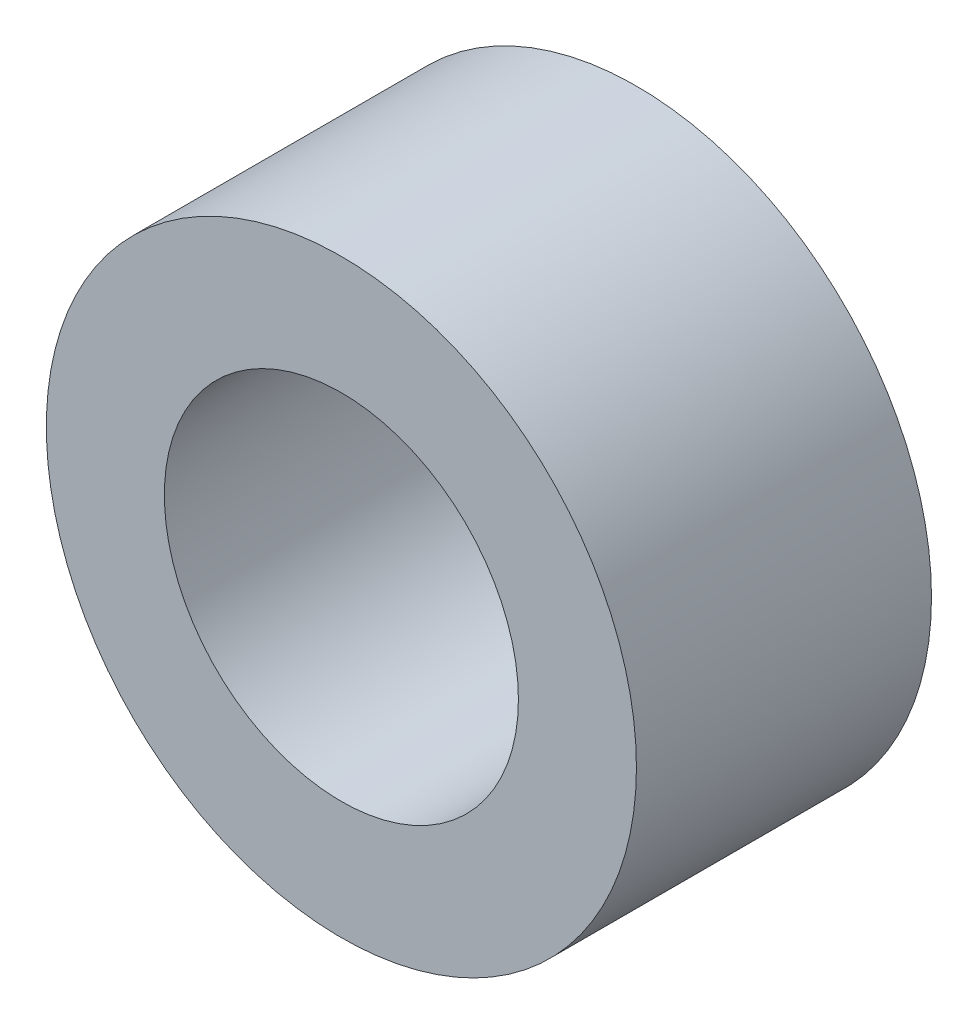
ISO-10303-21;
HEADER;
FILE_DESCRIPTION(('STEP AP214'),'2;1');
FILE_NAME('part.step','',(''),(''),'','','');
FILE_SCHEMA(('AUTOMOTIVE_DESIGN { 1 0 10303 214 1 1 1 1 }'));
ENDSEC;
DATA;
#1=APPLICATION_CONTEXT('core data for automotive mechanical design processes');
#2=APPLICATION_PROTOCOL_DEFINITION('international standard','automotive_design',2000,#1);
#3=PRODUCT_CONTEXT('',#1,'mechanical');
#4=PRODUCT('Part','Part','',(#3));
#5=PRODUCT_RELATED_PRODUCT_CATEGORY('part','',(#4));
#6=PRODUCT_DEFINITION_FORMATION('','',#4);
#7=PRODUCT_DEFINITION_CONTEXT('part definition',#1,'design');
#8=PRODUCT_DEFINITION('design','',#6,#7);
#9=PRODUCT_DEFINITION_SHAPE('','',#8);
#10=(LENGTH_UNIT() NAMED_UNIT(*) SI_UNIT(.MILLI.,.METRE.));
#11=(NAMED_UNIT(*) PLANE_ANGLE_UNIT() SI_UNIT($,.RADIAN.));
#12=(NAMED_UNIT(*) SI_UNIT($,.STERADIAN.) SOLID_ANGLE_UNIT());
#13=UNCERTAINTY_MEASURE_WITH_UNIT(LENGTH_MEASURE(1.E-05),#10,'distance_accuracy_value','');
#14=(GEOMETRIC_REPRESENTATION_CONTEXT(3) GLOBAL_UNCERTAINTY_ASSIGNED_CONTEXT((#13)) GLOBAL_UNIT_ASSIGNED_CONTEXT((#10,
#11,#12)) REPRESENTATION_CONTEXT('',''));
#15=CARTESIAN_POINT('',(0.,0.,0.));
#16=DIRECTION('',(0.,0.,1.));
#17=DIRECTION('',(1.,0.,0.));
#18=AXIS2_PLACEMENT_3D('',#15,#16,#17);
#19=CARTESIAN_POINT('',(0.,0.,5.));
#20=DIRECTION('',(0.,0.,1.));
#21=DIRECTION('',(1.,0.,0.));
#22=AXIS2_PLACEMENT_3D('',#19,#20,#21);
#23=PLANE('',#22);
#24=CARTESIAN_POINT('',(0.,0.,5.));
#25=DIRECTION('',(0.,0.,1.));
#26=DIRECTION('',(1.,0.,0.));
#27=AXIS2_PLACEMENT_3D('',#24,#25,#26);
#28=CIRCLE('',#27,5.);
#29=CARTESIAN_POINT('',(5.,0.,5.));
#30=VERTEX_POINT('',#29);
#31=EDGE_CURVE('E10',#30,#30,#28,.T.);
#32=ORIENTED_EDGE('',*,*,#31,.T.);
#33=EDGE_LOOP('',(#32));
#34=FACE_BOUND('',#33,.T.);
#35=CARTESIAN_POINT('',(0.,0.,5.));
#36=DIRECTION('',(0.,0.,1.));
#37=DIRECTION('',(1.,0.,0.));
#38=AXIS2_PLACEMENT_3D('',#35,#36,#37);
#39=CIRCLE('',#38,3.);
#40=CARTESIAN_POINT('',(3.,0.,5.));
#41=VERTEX_POINT('',#40);
#42=EDGE_CURVE('E43',#41,#41,#39,.T.);
#43=ORIENTED_EDGE('',*,*,#42,.F.);
#44=EDGE_LOOP('',(#43));
#45=FACE_BOUND('',#44,.T.);
#46=ADVANCED_FACE('F32',(#34,#45),#23,.T.);
#47=CARTESIAN_POINT('',(0.,0.,0.));
#48=DIRECTION('',(0.,0.,1.));
#49=DIRECTION('',(1.,0.,0.));
#50=AXIS2_PLACEMENT_3D('',#47,#48,#49);
#51=PLANE('',#50);
#52=CARTESIAN_POINT('',(0.,0.,0.));
#53=DIRECTION('',(0.,0.,1.));
#54=DIRECTION('',(1.,0.,0.));
#55=AXIS2_PLACEMENT_3D('',#52,#53,#54);
#56=CIRCLE('',#55,5.);
#57=CARTESIAN_POINT('',(5.,0.,0.));
#58=VERTEX_POINT('',#57);
#59=EDGE_CURVE('E36',#58,#58,#56,.T.);
#60=ORIENTED_EDGE('',*,*,#59,.F.);
#61=EDGE_LOOP('',(#60));
#62=FACE_BOUND('',#61,.T.);
#63=CARTESIAN_POINT('',(0.,0.,0.));
#64=DIRECTION('',(0.,0.,1.));
#65=DIRECTION('',(1.,0.,0.));
#66=AXIS2_PLACEMENT_3D('',#63,#64,#65);
#67=CIRCLE('',#66,3.);
#68=CARTESIAN_POINT('',(3.,0.,0.));
#69=VERTEX_POINT('',#68);
#70=EDGE_CURVE('E45',#69,#69,#67,.T.);
#71=ORIENTED_EDGE('',*,*,#70,.T.);
#72=EDGE_LOOP('',(#71));
#73=FACE_BOUND('',#72,.T.);
#74=ADVANCED_FACE('F55',(#62,#73),#51,.F.);
#75=CARTESIAN_POINT('',(0.,0.,5.));
#76=DIRECTION('',(0.,0.,-1.));
#77=DIRECTION('',(-1.,0.,0.));
#78=AXIS2_PLACEMENT_3D('',#75,#76,#77);
#79=CYLINDRICAL_SURFACE('',#78,5.);
#80=ORIENTED_EDGE('',*,*,#31,.F.);
#81=EDGE_LOOP('',(#80));
#82=FACE_BOUND('',#81,.T.);
#83=ORIENTED_EDGE('',*,*,#59,.T.);
#84=EDGE_LOOP('',(#83));
#85=FACE_BOUND('',#84,.T.);
#86=ADVANCED_FACE('F34',(#82,#85),#79,.T.);
#87=CARTESIAN_POINT('',(0.,0.,5.));
#88=DIRECTION('',(0.,0.,-1.));
#89=DIRECTION('',(-1.,0.,0.));
#90=AXIS2_PLACEMENT_3D('',#87,#88,#89);
#91=CYLINDRICAL_SURFACE('',#90,3.);
#92=ORIENTED_EDGE('',*,*,#42,.T.);
#93=EDGE_LOOP('',(#92));
#94=FACE_BOUND('',#93,.T.);
#95=ORIENTED_EDGE('',*,*,#70,.F.);
#96=EDGE_LOOP('',(#95));
#97=FACE_BOUND('',#96,.T.);
#98=ADVANCED_FACE('F51',(#94,#97),#91,.F.);
#99=CLOSED_SHELL('',(#46,#74,#86,#98));
#100=MANIFOLD_SOLID_BREP('B2',#99);
#101=ADVANCED_BREP_SHAPE_REPRESENTATION('',(#18,#100),#14);
#102=SHAPE_DEFINITION_REPRESENTATION(#9,#101);
ENDSEC;
END-ISO-10303-21;
